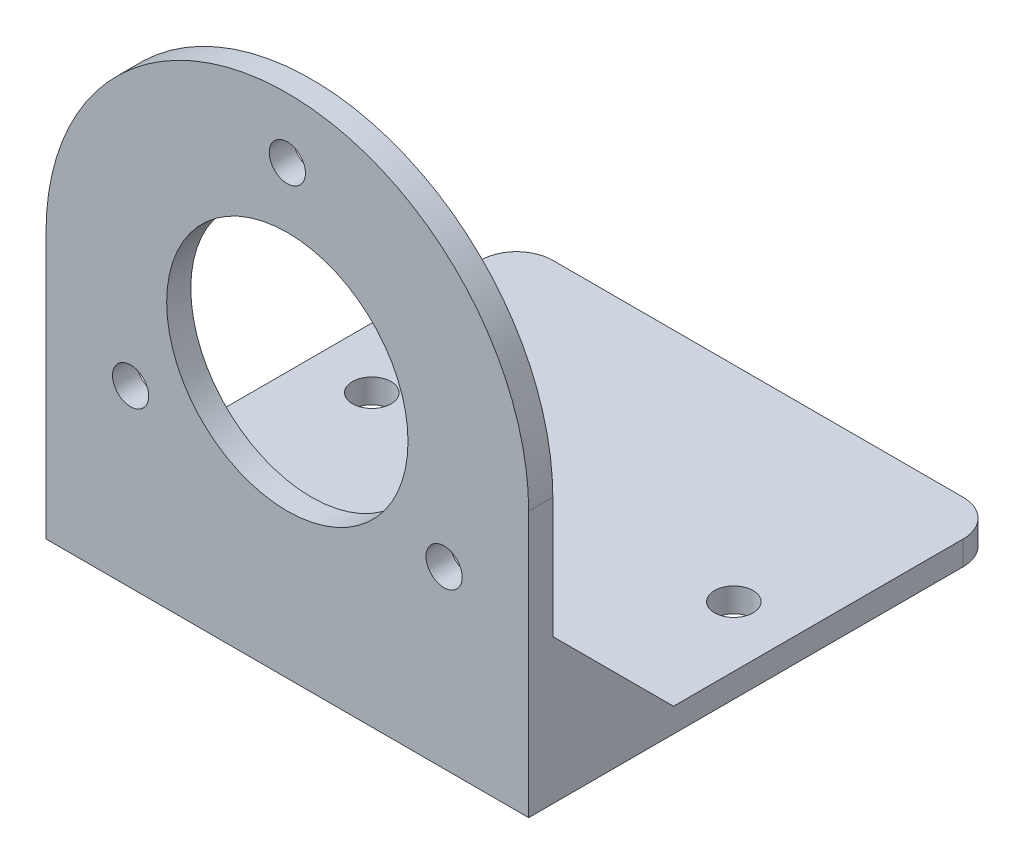
ISO-10303-21;
HEADER;
FILE_DESCRIPTION(('STEP AP214'),'2;1');
FILE_NAME('part.step','',(''),(''),'','','');
FILE_SCHEMA(('AUTOMOTIVE_DESIGN { 1 0 10303 214 1 1 1 1 }'));
ENDSEC;
DATA;
#1=APPLICATION_CONTEXT('core data for automotive mechanical design processes');
#2=APPLICATION_PROTOCOL_DEFINITION('international standard','automotive_design',2000,#1);
#3=PRODUCT_CONTEXT('',#1,'mechanical');
#4=PRODUCT('Part','Part','',(#3));
#5=PRODUCT_RELATED_PRODUCT_CATEGORY('part','',(#4));
#6=PRODUCT_DEFINITION_FORMATION('','',#4);
#7=PRODUCT_DEFINITION_CONTEXT('part definition',#1,'design');
#8=PRODUCT_DEFINITION('design','',#6,#7);
#9=PRODUCT_DEFINITION_SHAPE('','',#8);
#10=(LENGTH_UNIT() NAMED_UNIT(*) SI_UNIT(.MILLI.,.METRE.));
#11=(NAMED_UNIT(*) PLANE_ANGLE_UNIT() SI_UNIT($,.RADIAN.));
#12=(NAMED_UNIT(*) SI_UNIT($,.STERADIAN.) SOLID_ANGLE_UNIT());
#13=UNCERTAINTY_MEASURE_WITH_UNIT(LENGTH_MEASURE(1.E-05),#10,'distance_accuracy_value','');
#14=(GEOMETRIC_REPRESENTATION_CONTEXT(3) GLOBAL_UNCERTAINTY_ASSIGNED_CONTEXT((#13)) GLOBAL_UNIT_ASSIGNED_CONTEXT((#10,
#11,#12)) REPRESENTATION_CONTEXT('',''));
#15=CARTESIAN_POINT('',(0.,0.,0.));
#16=DIRECTION('',(0.,0.,1.));
#17=DIRECTION('',(1.,0.,0.));
#18=AXIS2_PLACEMENT_3D('',#15,#16,#17);
#19=CARTESIAN_POINT('',(0.,0.,0.));
#20=DIRECTION('',(0.,0.,1.));
#21=DIRECTION('',(1.,0.,0.));
#22=AXIS2_PLACEMENT_3D('',#19,#20,#21);
#23=PLANE('',#22);
#24=CARTESIAN_POINT('',(-12.9903810567656,-7.50000000000056,0.));
#25=DIRECTION('',(0.,0.,1.));
#26=DIRECTION('',(1.,0.,0.));
#27=AXIS2_PLACEMENT_3D('',#24,#25,#26);
#28=CIRCLE('',#27,1.50000000000122);
#29=CARTESIAN_POINT('',(-11.4903810567644,-7.50000000000056,0.));
#30=VERTEX_POINT('',#29);
#31=EDGE_CURVE('E196',#30,#30,#28,.T.);
#32=ORIENTED_EDGE('',*,*,#31,.T.);
#33=EDGE_LOOP('',(#32));
#34=FACE_BOUND('',#33,.T.);
#35=CARTESIAN_POINT('',(12.9903810567675,-7.49999999999945,0.));
#36=DIRECTION('',(0.,0.,1.));
#37=DIRECTION('',(1.,0.,0.));
#38=AXIS2_PLACEMENT_3D('',#35,#36,#37);
#39=CIRCLE('',#38,1.50000000000082);
#40=CARTESIAN_POINT('',(14.4903810567684,-7.49999999999945,0.));
#41=VERTEX_POINT('',#40);
#42=EDGE_CURVE('E200',#41,#41,#39,.T.);
#43=ORIENTED_EDGE('',*,*,#42,.T.);
#44=EDGE_LOOP('',(#43));
#45=FACE_BOUND('',#44,.T.);
#46=CARTESIAN_POINT('',(0.,0.,0.));
#47=DIRECTION('',(0.,0.,1.));
#48=DIRECTION('',(1.,0.,0.));
#49=AXIS2_PLACEMENT_3D('',#46,#47,#48);
#50=CIRCLE('',#49,10.);
#51=CARTESIAN_POINT('',(10.,0.,0.));
#52=VERTEX_POINT('',#51);
#53=EDGE_CURVE('E206',#52,#52,#50,.T.);
#54=ORIENTED_EDGE('',*,*,#53,.T.);
#55=EDGE_LOOP('',(#54));
#56=FACE_BOUND('',#55,.T.);
#57=CARTESIAN_POINT('',(0.,15.,0.));
#58=DIRECTION('',(0.,0.,1.));
#59=DIRECTION('',(1.,0.,0.));
#60=AXIS2_PLACEMENT_3D('',#57,#58,#59);
#61=CIRCLE('',#60,1.5);
#62=CARTESIAN_POINT('',(1.5,15.,0.));
#63=VERTEX_POINT('',#62);
#64=EDGE_CURVE('E212',#63,#63,#61,.T.);
#65=ORIENTED_EDGE('',*,*,#64,.T.);
#66=EDGE_LOOP('',(#65));
#67=FACE_BOUND('',#66,.T.);
#68=DIRECTION('',(0.,1.,0.));
#69=VECTOR('',#68,1.);
#70=CARTESIAN_POINT('',(20.,-22.,0.));
#71=LINE('',#70,#69);
#72=CARTESIAN_POINT('',(20.,-10.,0.));
#73=VERTEX_POINT('',#72);
#74=CARTESIAN_POINT('',(20.,0.,0.));
#75=VERTEX_POINT('',#74);
#76=EDGE_CURVE('E225',#73,#75,#71,.T.);
#77=ORIENTED_EDGE('',*,*,#76,.F.);
#78=DIRECTION('',(-1.,0.,0.));
#79=VECTOR('',#78,1.);
#80=CARTESIAN_POINT('',(0.,-10.,0.));
#81=LINE('',#80,#79);
#82=CARTESIAN_POINT('',(18.5,-10.,0.));
#83=VERTEX_POINT('',#82);
#84=EDGE_CURVE('E147',#73,#83,#81,.T.);
#85=ORIENTED_EDGE('',*,*,#84,.T.);
#86=DIRECTION('',(0.,-1.,0.));
#87=VECTOR('',#86,1.);
#88=CARTESIAN_POINT('',(18.5,0.,0.));
#89=LINE('',#88,#87);
#90=CARTESIAN_POINT('',(18.5,-20.,0.));
#91=VERTEX_POINT('',#90);
#92=EDGE_CURVE('E127',#83,#91,#89,.T.);
#93=ORIENTED_EDGE('',*,*,#92,.T.);
#94=DIRECTION('',(1.,0.,0.));
#95=VECTOR('',#94,1.);
#96=CARTESIAN_POINT('',(20.,-20.,0.));
#97=LINE('',#96,#95);
#98=CARTESIAN_POINT('',(-18.5,-20.,0.));
#99=VERTEX_POINT('',#98);
#100=EDGE_CURVE('E142',#99,#91,#97,.T.);
#101=ORIENTED_EDGE('',*,*,#100,.F.);
#102=DIRECTION('',(0.,1.,0.));
#103=VECTOR('',#102,1.);
#104=CARTESIAN_POINT('',(-18.5,0.,0.));
#105=LINE('',#104,#103);
#106=CARTESIAN_POINT('',(-18.5,-10.,0.));
#107=VERTEX_POINT('',#106);
#108=EDGE_CURVE('E50',#99,#107,#105,.T.);
#109=ORIENTED_EDGE('',*,*,#108,.T.);
#110=DIRECTION('',(1.,0.,0.));
#111=VECTOR('',#110,1.);
#112=CARTESIAN_POINT('',(0.,-10.,0.));
#113=LINE('',#112,#111);
#114=CARTESIAN_POINT('',(-20.,-10.,0.));
#115=VERTEX_POINT('',#114);
#116=EDGE_CURVE('E54',#107,#115,#113,.F.);
#117=ORIENTED_EDGE('',*,*,#116,.T.);
#118=DIRECTION('',(0.,-1.,0.));
#119=VECTOR('',#118,1.);
#120=CARTESIAN_POINT('',(-20.,0.,0.));
#121=LINE('',#120,#119);
#122=CARTESIAN_POINT('',(-20.,0.,0.));
#123=VERTEX_POINT('',#122);
#124=EDGE_CURVE('E234',#123,#115,#121,.T.);
#125=ORIENTED_EDGE('',*,*,#124,.F.);
#126=CARTESIAN_POINT('',(0.,0.,0.));
#127=DIRECTION('',(0.,0.,1.));
#128=DIRECTION('',(1.,0.,0.));
#129=AXIS2_PLACEMENT_3D('',#126,#127,#128);
#130=CIRCLE('',#129,20.);
#131=EDGE_CURVE('E218',#75,#123,#130,.T.);
#132=ORIENTED_EDGE('',*,*,#131,.F.);
#133=EDGE_LOOP('',(#77,#85,#93,#101,#109,#117,#125,#132));
#134=FACE_BOUND('',#133,.T.);
#135=ADVANCED_FACE('F35',(#34,#45,#56,#67,#134),#23,.F.);
#136=CARTESIAN_POINT('',(0.,0.,2.));
#137=DIRECTION('',(0.,0.,1.));
#138=DIRECTION('',(1.,0.,0.));
#139=AXIS2_PLACEMENT_3D('',#136,#137,#138);
#140=PLANE('',#139);
#141=DIRECTION('',(0.,1.,0.));
#142=VECTOR('',#141,1.);
#143=CARTESIAN_POINT('',(20.,-22.,2.));
#144=LINE('',#143,#142);
#145=CARTESIAN_POINT('',(20.,-22.,2.));
#146=VERTEX_POINT('',#145);
#147=CARTESIAN_POINT('',(20.,0.,2.));
#148=VERTEX_POINT('',#147);
#149=EDGE_CURVE('E229',#146,#148,#144,.T.);
#150=ORIENTED_EDGE('',*,*,#149,.T.);
#151=CARTESIAN_POINT('',(0.,0.,2.));
#152=DIRECTION('',(0.,0.,1.));
#153=DIRECTION('',(1.,0.,0.));
#154=AXIS2_PLACEMENT_3D('',#151,#152,#153);
#155=CIRCLE('',#154,20.);
#156=CARTESIAN_POINT('',(-20.,0.,2.));
#157=VERTEX_POINT('',#156);
#158=EDGE_CURVE('E221',#148,#157,#155,.T.);
#159=ORIENTED_EDGE('',*,*,#158,.T.);
#160=DIRECTION('',(0.,-1.,0.));
#161=VECTOR('',#160,1.);
#162=CARTESIAN_POINT('',(-20.,0.,2.));
#163=LINE('',#162,#161);
#164=CARTESIAN_POINT('',(-20.,-22.,2.));
#165=VERTEX_POINT('',#164);
#166=EDGE_CURVE('E224',#157,#165,#163,.T.);
#167=ORIENTED_EDGE('',*,*,#166,.T.);
#168=DIRECTION('',(1.,0.,0.));
#169=VECTOR('',#168,1.);
#170=CARTESIAN_POINT('',(-20.,-22.,2.));
#171=LINE('',#170,#169);
#172=EDGE_CURVE('E227',#165,#146,#171,.T.);
#173=ORIENTED_EDGE('',*,*,#172,.T.);
#174=EDGE_LOOP('',(#150,#159,#167,#173));
#175=FACE_BOUND('',#174,.T.);
#176=CARTESIAN_POINT('',(12.9903810567675,-7.49999999999945,2.));
#177=DIRECTION('',(0.,0.,1.));
#178=DIRECTION('',(1.,0.,0.));
#179=AXIS2_PLACEMENT_3D('',#176,#177,#178);
#180=CIRCLE('',#179,1.50000000000082);
#181=CARTESIAN_POINT('',(14.4903810567684,-7.49999999999945,2.));
#182=VERTEX_POINT('',#181);
#183=EDGE_CURVE('E203',#182,#182,#180,.T.);
#184=ORIENTED_EDGE('',*,*,#183,.F.);
#185=EDGE_LOOP('',(#184));
#186=FACE_BOUND('',#185,.T.);
#187=CARTESIAN_POINT('',(0.,15.,2.));
#188=DIRECTION('',(0.,0.,1.));
#189=DIRECTION('',(1.,0.,0.));
#190=AXIS2_PLACEMENT_3D('',#187,#188,#189);
#191=CIRCLE('',#190,1.5);
#192=CARTESIAN_POINT('',(1.5,15.,2.));
#193=VERTEX_POINT('',#192);
#194=EDGE_CURVE('E215',#193,#193,#191,.T.);
#195=ORIENTED_EDGE('',*,*,#194,.F.);
#196=EDGE_LOOP('',(#195));
#197=FACE_BOUND('',#196,.T.);
#198=CARTESIAN_POINT('',(0.,0.,2.));
#199=DIRECTION('',(0.,0.,1.));
#200=DIRECTION('',(1.,0.,0.));
#201=AXIS2_PLACEMENT_3D('',#198,#199,#200);
#202=CIRCLE('',#201,10.);
#203=CARTESIAN_POINT('',(10.,0.,2.));
#204=VERTEX_POINT('',#203);
#205=EDGE_CURVE('E209',#204,#204,#202,.T.);
#206=ORIENTED_EDGE('',*,*,#205,.F.);
#207=EDGE_LOOP('',(#206));
#208=FACE_BOUND('',#207,.T.);
#209=CARTESIAN_POINT('',(-12.9903810567656,-7.50000000000056,2.));
#210=DIRECTION('',(0.,0.,1.));
#211=DIRECTION('',(1.,0.,0.));
#212=AXIS2_PLACEMENT_3D('',#209,#210,#211);
#213=CIRCLE('',#212,1.50000000000122);
#214=CARTESIAN_POINT('',(-11.4903810567644,-7.50000000000056,2.));
#215=VERTEX_POINT('',#214);
#216=EDGE_CURVE('E197',#215,#215,#213,.T.);
#217=ORIENTED_EDGE('',*,*,#216,.F.);
#218=EDGE_LOOP('',(#217));
#219=FACE_BOUND('',#218,.T.);
#220=ADVANCED_FACE('F297',(#175,#186,#197,#208,#219),#140,.T.);
#221=CARTESIAN_POINT('',(0.,0.,2.));
#222=DIRECTION('',(0.,0.,-1.));
#223=DIRECTION('',(-1.,0.,0.));
#224=AXIS2_PLACEMENT_3D('',#221,#222,#223);
#225=CYLINDRICAL_SURFACE('',#224,20.);
#226=ORIENTED_EDGE('',*,*,#131,.T.);
#227=DIRECTION('',(0.,0.,-1.));
#228=VECTOR('',#227,1.);
#229=CARTESIAN_POINT('',(-20.,0.,2.));
#230=LINE('',#229,#228);
#231=EDGE_CURVE('E245',#157,#123,#230,.T.);
#232=ORIENTED_EDGE('',*,*,#231,.F.);
#233=ORIENTED_EDGE('',*,*,#158,.F.);
#234=DIRECTION('',(0.,0.,-1.));
#235=VECTOR('',#234,1.);
#236=CARTESIAN_POINT('',(20.,0.,2.));
#237=LINE('',#236,#235);
#238=EDGE_CURVE('E231',#148,#75,#237,.T.);
#239=ORIENTED_EDGE('',*,*,#238,.T.);
#240=EDGE_LOOP('',(#226,#232,#233,#239));
#241=FACE_BOUND('',#240,.T.);
#242=ADVANCED_FACE('F303',(#241),#225,.T.);
#243=CARTESIAN_POINT('',(-20.,0.,2.));
#244=DIRECTION('',(1.,0.,0.));
#245=DIRECTION('',(0.,1.,0.));
#246=AXIS2_PLACEMENT_3D('',#243,#244,#245);
#247=PLANE('',#246);
#248=DIRECTION('',(0.,0.,-1.));
#249=VECTOR('',#248,1.);
#250=CARTESIAN_POINT('',(-20.,-22.,2.));
#251=LINE('',#250,#249);
#252=CARTESIAN_POINT('',(-20.,-22.,-34.));
#253=VERTEX_POINT('',#252);
#254=EDGE_CURVE('E242',#165,#253,#251,.T.);
#255=ORIENTED_EDGE('',*,*,#254,.F.);
#256=ORIENTED_EDGE('',*,*,#166,.F.);
#257=ORIENTED_EDGE('',*,*,#231,.T.);
#258=ORIENTED_EDGE('',*,*,#124,.T.);
#259=DIRECTION('',(0.,-0.707106781186539,-0.707106781186556));
#260=VECTOR('',#259,1.);
#261=CARTESIAN_POINT('',(-20.,-10.,0.));
#262=LINE('',#261,#260);
#263=CARTESIAN_POINT('',(-20.,-20.,-10.0000000000002));
#264=VERTEX_POINT('',#263);
#265=EDGE_CURVE('E149',#115,#264,#262,.T.);
#266=ORIENTED_EDGE('',*,*,#265,.T.);
#267=DIRECTION('',(0.,0.,1.));
#268=VECTOR('',#267,1.);
#269=CARTESIAN_POINT('',(-20.,-20.,-37.));
#270=LINE('',#269,#268);
#271=CARTESIAN_POINT('',(-20.,-20.,-34.));
#272=VERTEX_POINT('',#271);
#273=EDGE_CURVE('E194',#272,#264,#270,.T.);
#274=ORIENTED_EDGE('',*,*,#273,.F.);
#275=DIRECTION('',(0.,1.,0.));
#276=VECTOR('',#275,1.);
#277=CARTESIAN_POINT('',(-20.,-22.,-34.));
#278=LINE('',#277,#276);
#279=EDGE_CURVE('E258',#272,#253,#278,.F.);
#280=ORIENTED_EDGE('',*,*,#279,.T.);
#281=EDGE_LOOP('',(#255,#256,#257,#258,#266,#274,#280));
#282=FACE_BOUND('',#281,.T.);
#283=ADVANCED_FACE('F277',(#282),#247,.F.);
#284=CARTESIAN_POINT('',(-20.,-22.,2.));
#285=DIRECTION('',(0.,1.,0.));
#286=DIRECTION('',(0.,0.,1.));
#287=AXIS2_PLACEMENT_3D('',#284,#285,#286);
#288=PLANE('',#287);
#289=CARTESIAN_POINT('',(-15.,-22.,-20.));
#290=DIRECTION('',(0.,1.,0.));
#291=DIRECTION('',(1.,0.,0.));
#292=AXIS2_PLACEMENT_3D('',#289,#290,#291);
#293=CIRCLE('',#292,1.6);
#294=CARTESIAN_POINT('',(-13.4,-22.,-20.));
#295=VERTEX_POINT('',#294);
#296=EDGE_CURVE('E175',#295,#295,#293,.T.);
#297=ORIENTED_EDGE('',*,*,#296,.T.);
#298=EDGE_LOOP('',(#297));
#299=FACE_BOUND('',#298,.T.);
#300=CARTESIAN_POINT('',(-15.,-22.,-3.));
#301=DIRECTION('',(0.,1.,0.));
#302=DIRECTION('',(1.,0.,0.));
#303=AXIS2_PLACEMENT_3D('',#300,#301,#302);
#304=CIRCLE('',#303,1.6);
#305=CARTESIAN_POINT('',(-13.4,-22.,-3.));
#306=VERTEX_POINT('',#305);
#307=EDGE_CURVE('E169',#306,#306,#304,.T.);
#308=ORIENTED_EDGE('',*,*,#307,.T.);
#309=EDGE_LOOP('',(#308));
#310=FACE_BOUND('',#309,.T.);
#311=CARTESIAN_POINT('',(15.,-22.,-3.));
#312=DIRECTION('',(0.,1.,0.));
#313=DIRECTION('',(-1.,0.,0.));
#314=AXIS2_PLACEMENT_3D('',#311,#312,#313);
#315=CIRCLE('',#314,1.6);
#316=CARTESIAN_POINT('',(13.4,-22.,-3.));
#317=VERTEX_POINT('',#316);
#318=EDGE_CURVE('E162',#317,#317,#315,.T.);
#319=ORIENTED_EDGE('',*,*,#318,.T.);
#320=EDGE_LOOP('',(#319));
#321=FACE_BOUND('',#320,.T.);
#322=CARTESIAN_POINT('',(15.,-22.,-20.));
#323=DIRECTION('',(0.,1.,0.));
#324=DIRECTION('',(-1.,0.,0.));
#325=AXIS2_PLACEMENT_3D('',#322,#323,#324);
#326=CIRCLE('',#325,1.6);
#327=CARTESIAN_POINT('',(13.4,-22.,-20.));
#328=VERTEX_POINT('',#327);
#329=EDGE_CURVE('E180',#328,#328,#326,.T.);
#330=ORIENTED_EDGE('',*,*,#329,.T.);
#331=EDGE_LOOP('',(#330));
#332=FACE_BOUND('',#331,.T.);
#333=ORIENTED_EDGE('',*,*,#254,.T.);
#334=CARTESIAN_POINT('',(-17.,-22.,-34.));
#335=DIRECTION('',(0.,1.,0.));
#336=DIRECTION('',(0.,0.,1.));
#337=AXIS2_PLACEMENT_3D('',#334,#335,#336);
#338=CIRCLE('',#337,3.);
#339=CARTESIAN_POINT('',(-17.,-22.,-37.));
#340=VERTEX_POINT('',#339);
#341=EDGE_CURVE('E43',#253,#340,#338,.F.);
#342=ORIENTED_EDGE('',*,*,#341,.T.);
#343=DIRECTION('',(-1.,0.,0.));
#344=VECTOR('',#343,1.);
#345=CARTESIAN_POINT('',(20.,-22.,-37.));
#346=LINE('',#345,#344);
#347=CARTESIAN_POINT('',(17.,-22.,-37.));
#348=VERTEX_POINT('',#347);
#349=EDGE_CURVE('E188',#348,#340,#346,.T.);
#350=ORIENTED_EDGE('',*,*,#349,.F.);
#351=CARTESIAN_POINT('',(17.,-22.,-34.));
#352=DIRECTION('',(0.,1.,0.));
#353=DIRECTION('',(0.,0.,1.));
#354=AXIS2_PLACEMENT_3D('',#351,#352,#353);
#355=CIRCLE('',#354,3.);
#356=CARTESIAN_POINT('',(20.,-22.,-34.));
#357=VERTEX_POINT('',#356);
#358=EDGE_CURVE('E260',#348,#357,#355,.F.);
#359=ORIENTED_EDGE('',*,*,#358,.T.);
#360=DIRECTION('',(0.,0.,-1.));
#361=VECTOR('',#360,1.);
#362=CARTESIAN_POINT('',(20.,-22.,2.));
#363=LINE('',#362,#361);
#364=EDGE_CURVE('E239',#146,#357,#363,.T.);
#365=ORIENTED_EDGE('',*,*,#364,.F.);
#366=ORIENTED_EDGE('',*,*,#172,.F.);
#367=EDGE_LOOP('',(#333,#342,#350,#359,#365,#366));
#368=FACE_BOUND('',#367,.T.);
#369=ADVANCED_FACE('F264',(#299,#310,#321,#332,#368),#288,.F.);
#370=CARTESIAN_POINT('',(20.,-22.,2.));
#371=DIRECTION('',(-1.,0.,0.));
#372=DIRECTION('',(0.,-1.,0.));
#373=AXIS2_PLACEMENT_3D('',#370,#371,#372);
#374=PLANE('',#373);
#375=DIRECTION('',(0.,-0.707106781186539,-0.707106781186556));
#376=VECTOR('',#375,1.);
#377=CARTESIAN_POINT('',(20.,-10.,0.));
#378=LINE('',#377,#376);
#379=CARTESIAN_POINT('',(20.,-20.,-10.0000000000002));
#380=VERTEX_POINT('',#379);
#381=EDGE_CURVE('E135',#73,#380,#378,.T.);
#382=ORIENTED_EDGE('',*,*,#381,.F.);
#383=ORIENTED_EDGE('',*,*,#76,.T.);
#384=ORIENTED_EDGE('',*,*,#238,.F.);
#385=ORIENTED_EDGE('',*,*,#149,.F.);
#386=ORIENTED_EDGE('',*,*,#364,.T.);
#387=DIRECTION('',(0.,-1.,0.));
#388=VECTOR('',#387,1.);
#389=CARTESIAN_POINT('',(20.,-20.,-34.));
#390=LINE('',#389,#388);
#391=CARTESIAN_POINT('',(20.,-20.,-34.));
#392=VERTEX_POINT('',#391);
#393=EDGE_CURVE('E11',#357,#392,#390,.F.);
#394=ORIENTED_EDGE('',*,*,#393,.T.);
#395=DIRECTION('',(0.,0.,1.));
#396=VECTOR('',#395,1.);
#397=CARTESIAN_POINT('',(20.,-20.,-37.));
#398=LINE('',#397,#396);
#399=EDGE_CURVE('E191',#392,#380,#398,.T.);
#400=ORIENTED_EDGE('',*,*,#399,.T.);
#401=EDGE_LOOP('',(#382,#383,#384,#385,#386,#394,#400));
#402=FACE_BOUND('',#401,.T.);
#403=ADVANCED_FACE('F309',(#402),#374,.F.);
#404=CARTESIAN_POINT('',(0.,15.,2.));
#405=DIRECTION('',(0.,0.,-1.));
#406=DIRECTION('',(-1.,0.,0.));
#407=AXIS2_PLACEMENT_3D('',#404,#405,#406);
#408=CYLINDRICAL_SURFACE('',#407,1.5);
#409=ORIENTED_EDGE('',*,*,#194,.T.);
#410=EDGE_LOOP('',(#409));
#411=FACE_BOUND('',#410,.T.);
#412=ORIENTED_EDGE('',*,*,#64,.F.);
#413=EDGE_LOOP('',(#412));
#414=FACE_BOUND('',#413,.T.);
#415=ADVANCED_FACE('F312',(#411,#414),#408,.F.);
#416=CARTESIAN_POINT('',(0.,0.,2.));
#417=DIRECTION('',(0.,0.,-1.));
#418=DIRECTION('',(-1.,0.,0.));
#419=AXIS2_PLACEMENT_3D('',#416,#417,#418);
#420=CYLINDRICAL_SURFACE('',#419,10.);
#421=ORIENTED_EDGE('',*,*,#205,.T.);
#422=EDGE_LOOP('',(#421));
#423=FACE_BOUND('',#422,.T.);
#424=ORIENTED_EDGE('',*,*,#53,.F.);
#425=EDGE_LOOP('',(#424));
#426=FACE_BOUND('',#425,.T.);
#427=ADVANCED_FACE('F345',(#423,#426),#420,.F.);
#428=CARTESIAN_POINT('',(12.9903810567675,-7.49999999999945,2.));
#429=DIRECTION('',(0.,0.,-1.));
#430=DIRECTION('',(-1.,0.,0.));
#431=AXIS2_PLACEMENT_3D('',#428,#429,#430);
#432=CYLINDRICAL_SURFACE('',#431,1.50000000000082);
#433=ORIENTED_EDGE('',*,*,#183,.T.);
#434=EDGE_LOOP('',(#433));
#435=FACE_BOUND('',#434,.T.);
#436=ORIENTED_EDGE('',*,*,#42,.F.);
#437=EDGE_LOOP('',(#436));
#438=FACE_BOUND('',#437,.T.);
#439=ADVANCED_FACE('F341',(#435,#438),#432,.F.);
#440=CARTESIAN_POINT('',(-12.9903810567656,-7.50000000000056,2.));
#441=DIRECTION('',(0.,0.,-1.));
#442=DIRECTION('',(-1.,0.,0.));
#443=AXIS2_PLACEMENT_3D('',#440,#441,#442);
#444=CYLINDRICAL_SURFACE('',#443,1.50000000000122);
#445=ORIENTED_EDGE('',*,*,#216,.T.);
#446=EDGE_LOOP('',(#445));
#447=FACE_BOUND('',#446,.T.);
#448=ORIENTED_EDGE('',*,*,#31,.F.);
#449=EDGE_LOOP('',(#448));
#450=FACE_BOUND('',#449,.T.);
#451=ADVANCED_FACE('F333',(#447,#450),#444,.F.);
#452=CARTESIAN_POINT('',(20.,-20.,-37.));
#453=DIRECTION('',(0.,-1.,0.));
#454=DIRECTION('',(1.,0.,0.));
#455=AXIS2_PLACEMENT_3D('',#452,#453,#454);
#456=PLANE('',#455);
#457=CARTESIAN_POINT('',(-15.,-20.,-20.));
#458=DIRECTION('',(0.,1.,0.));
#459=DIRECTION('',(1.,0.,0.));
#460=AXIS2_PLACEMENT_3D('',#457,#458,#459);
#461=CIRCLE('',#460,1.6);
#462=CARTESIAN_POINT('',(-13.4,-20.,-20.));
#463=VERTEX_POINT('',#462);
#464=EDGE_CURVE('E161',#463,#463,#461,.T.);
#465=ORIENTED_EDGE('',*,*,#464,.F.);
#466=EDGE_LOOP('',(#465));
#467=FACE_BOUND('',#466,.T.);
#468=CARTESIAN_POINT('',(-15.,-20.,-3.));
#469=DIRECTION('',(0.,1.,0.));
#470=DIRECTION('',(1.,0.,0.));
#471=AXIS2_PLACEMENT_3D('',#468,#469,#470);
#472=CIRCLE('',#471,1.6);
#473=CARTESIAN_POINT('',(-13.4,-20.,-3.));
#474=VERTEX_POINT('',#473);
#475=EDGE_CURVE('E172',#474,#474,#472,.T.);
#476=ORIENTED_EDGE('',*,*,#475,.F.);
#477=EDGE_LOOP('',(#476));
#478=FACE_BOUND('',#477,.T.);
#479=CARTESIAN_POINT('',(15.,-20.,-3.));
#480=DIRECTION('',(0.,1.,0.));
#481=DIRECTION('',(-1.,0.,0.));
#482=AXIS2_PLACEMENT_3D('',#479,#480,#481);
#483=CIRCLE('',#482,1.6);
#484=CARTESIAN_POINT('',(13.4,-20.,-3.));
#485=VERTEX_POINT('',#484);
#486=EDGE_CURVE('E166',#485,#485,#483,.T.);
#487=ORIENTED_EDGE('',*,*,#486,.F.);
#488=EDGE_LOOP('',(#487));
#489=FACE_BOUND('',#488,.T.);
#490=CARTESIAN_POINT('',(15.,-20.,-20.));
#491=DIRECTION('',(0.,1.,0.));
#492=DIRECTION('',(-1.,0.,0.));
#493=AXIS2_PLACEMENT_3D('',#490,#491,#492);
#494=CIRCLE('',#493,1.6);
#495=CARTESIAN_POINT('',(13.4,-20.,-20.));
#496=VERTEX_POINT('',#495);
#497=EDGE_CURVE('E165',#496,#496,#494,.T.);
#498=ORIENTED_EDGE('',*,*,#497,.F.);
#499=EDGE_LOOP('',(#498));
#500=FACE_BOUND('',#499,.T.);
#501=DIRECTION('',(0.,0.,1.));
#502=VECTOR('',#501,1.);
#503=CARTESIAN_POINT('',(18.5,-20.,-17.5));
#504=LINE('',#503,#502);
#505=CARTESIAN_POINT('',(18.5,-20.,-10.0000000000002));
#506=VERTEX_POINT('',#505);
#507=EDGE_CURVE('E125',#506,#91,#504,.T.);
#508=ORIENTED_EDGE('',*,*,#507,.F.);
#509=DIRECTION('',(-1.,0.,0.));
#510=VECTOR('',#509,1.);
#511=CARTESIAN_POINT('',(20.,-20.,-10.0000000000002));
#512=LINE('',#511,#510);
#513=EDGE_CURVE('E130',#380,#506,#512,.T.);
#514=ORIENTED_EDGE('',*,*,#513,.F.);
#515=ORIENTED_EDGE('',*,*,#399,.F.);
#516=CARTESIAN_POINT('',(17.,-20.,-34.));
#517=DIRECTION('',(0.,-1.,0.));
#518=DIRECTION('',(1.,0.,0.));
#519=AXIS2_PLACEMENT_3D('',#516,#517,#518);
#520=CIRCLE('',#519,3.);
#521=CARTESIAN_POINT('',(17.,-20.,-37.));
#522=VERTEX_POINT('',#521);
#523=EDGE_CURVE('E254',#392,#522,#520,.F.);
#524=ORIENTED_EDGE('',*,*,#523,.T.);
#525=DIRECTION('',(1.,0.,0.));
#526=VECTOR('',#525,1.);
#527=CARTESIAN_POINT('',(20.,-20.,-37.));
#528=LINE('',#527,#526);
#529=CARTESIAN_POINT('',(-17.,-20.,-37.));
#530=VERTEX_POINT('',#529);
#531=EDGE_CURVE('E185',#530,#522,#528,.T.);
#532=ORIENTED_EDGE('',*,*,#531,.F.);
#533=CARTESIAN_POINT('',(-17.,-20.,-34.));
#534=DIRECTION('',(0.,-1.,0.));
#535=DIRECTION('',(1.,0.,0.));
#536=AXIS2_PLACEMENT_3D('',#533,#534,#535);
#537=CIRCLE('',#536,3.);
#538=EDGE_CURVE('E256',#530,#272,#537,.F.);
#539=ORIENTED_EDGE('',*,*,#538,.T.);
#540=ORIENTED_EDGE('',*,*,#273,.T.);
#541=DIRECTION('',(1.,0.,0.));
#542=VECTOR('',#541,1.);
#543=CARTESIAN_POINT('',(-20.,-20.,-10.0000000000002));
#544=LINE('',#543,#542);
#545=CARTESIAN_POINT('',(-18.5,-20.,-10.0000000000002));
#546=VERTEX_POINT('',#545);
#547=EDGE_CURVE('E153',#264,#546,#544,.T.);
#548=ORIENTED_EDGE('',*,*,#547,.T.);
#549=DIRECTION('',(0.,0.,1.));
#550=VECTOR('',#549,1.);
#551=CARTESIAN_POINT('',(-18.5,-20.,-17.5));
#552=LINE('',#551,#550);
#553=EDGE_CURVE('E154',#546,#99,#552,.T.);
#554=ORIENTED_EDGE('',*,*,#553,.T.);
#555=ORIENTED_EDGE('',*,*,#100,.T.);
#556=EDGE_LOOP('',(#508,#514,#515,#524,#532,#539,#540,#548,#554,#555));
#557=FACE_BOUND('',#556,.T.);
#558=ADVANCED_FACE('F141',(#467,#478,#489,#500,#557),#456,.F.);
#559=CARTESIAN_POINT('',(0.,0.,-37.));
#560=DIRECTION('',(0.,0.,-1.));
#561=DIRECTION('',(-1.,0.,0.));
#562=AXIS2_PLACEMENT_3D('',#559,#560,#561);
#563=PLANE('',#562);
#564=ORIENTED_EDGE('',*,*,#349,.T.);
#565=DIRECTION('',(0.,1.,0.));
#566=VECTOR('',#565,1.);
#567=CARTESIAN_POINT('',(-17.,-20.,-37.));
#568=LINE('',#567,#566);
#569=EDGE_CURVE('E251',#340,#530,#568,.T.);
#570=ORIENTED_EDGE('',*,*,#569,.T.);
#571=ORIENTED_EDGE('',*,*,#531,.T.);
#572=DIRECTION('',(0.,-1.,0.));
#573=VECTOR('',#572,1.);
#574=CARTESIAN_POINT('',(17.,-22.,-37.));
#575=LINE('',#574,#573);
#576=EDGE_CURVE('E248',#522,#348,#575,.T.);
#577=ORIENTED_EDGE('',*,*,#576,.T.);
#578=EDGE_LOOP('',(#564,#570,#571,#577));
#579=FACE_BOUND('',#578,.T.);
#580=ADVANCED_FACE('F271',(#579),#563,.T.);
#581=CARTESIAN_POINT('',(-17.,0.,-34.));
#582=DIRECTION('',(0.,-1.,0.));
#583=DIRECTION('',(1.,0.,0.));
#584=AXIS2_PLACEMENT_3D('',#581,#582,#583);
#585=CYLINDRICAL_SURFACE('',#584,3.);
#586=ORIENTED_EDGE('',*,*,#341,.F.);
#587=ORIENTED_EDGE('',*,*,#279,.F.);
#588=ORIENTED_EDGE('',*,*,#538,.F.);
#589=ORIENTED_EDGE('',*,*,#569,.F.);
#590=EDGE_LOOP('',(#586,#587,#588,#589));
#591=FACE_BOUND('',#590,.T.);
#592=ADVANCED_FACE('F274',(#591),#585,.T.);
#593=CARTESIAN_POINT('',(17.,0.,-34.));
#594=DIRECTION('',(0.,1.,0.));
#595=DIRECTION('',(-1.,0.,0.));
#596=AXIS2_PLACEMENT_3D('',#593,#594,#595);
#597=CYLINDRICAL_SURFACE('',#596,3.);
#598=ORIENTED_EDGE('',*,*,#523,.F.);
#599=ORIENTED_EDGE('',*,*,#393,.F.);
#600=ORIENTED_EDGE('',*,*,#358,.F.);
#601=ORIENTED_EDGE('',*,*,#576,.F.);
#602=EDGE_LOOP('',(#598,#599,#600,#601));
#603=FACE_BOUND('',#602,.T.);
#604=ADVANCED_FACE('F37',(#603),#597,.T.);
#605=CARTESIAN_POINT('',(15.,-22.,-20.));
#606=DIRECTION('',(0.,1.,0.));
#607=DIRECTION('',(-1.,0.,0.));
#608=AXIS2_PLACEMENT_3D('',#605,#606,#607);
#609=CYLINDRICAL_SURFACE('',#608,1.6);
#610=ORIENTED_EDGE('',*,*,#329,.F.);
#611=EDGE_LOOP('',(#610));
#612=FACE_BOUND('',#611,.T.);
#613=ORIENTED_EDGE('',*,*,#497,.T.);
#614=EDGE_LOOP('',(#613));
#615=FACE_BOUND('',#614,.T.);
#616=ADVANCED_FACE('F326',(#612,#615),#609,.F.);
#617=CARTESIAN_POINT('',(15.,-22.,-3.));
#618=DIRECTION('',(0.,1.,0.));
#619=DIRECTION('',(-1.,0.,0.));
#620=AXIS2_PLACEMENT_3D('',#617,#618,#619);
#621=CYLINDRICAL_SURFACE('',#620,1.6);
#622=ORIENTED_EDGE('',*,*,#318,.F.);
#623=EDGE_LOOP('',(#622));
#624=FACE_BOUND('',#623,.T.);
#625=ORIENTED_EDGE('',*,*,#486,.T.);
#626=EDGE_LOOP('',(#625));
#627=FACE_BOUND('',#626,.T.);
#628=ADVANCED_FACE('F412',(#624,#627),#621,.F.);
#629=CARTESIAN_POINT('',(-15.,-22.,-3.));
#630=DIRECTION('',(0.,1.,0.));
#631=DIRECTION('',(-1.,0.,0.));
#632=AXIS2_PLACEMENT_3D('',#629,#630,#631);
#633=CYLINDRICAL_SURFACE('',#632,1.6);
#634=ORIENTED_EDGE('',*,*,#307,.F.);
#635=EDGE_LOOP('',(#634));
#636=FACE_BOUND('',#635,.T.);
#637=ORIENTED_EDGE('',*,*,#475,.T.);
#638=EDGE_LOOP('',(#637));
#639=FACE_BOUND('',#638,.T.);
#640=ADVANCED_FACE('F420',(#636,#639),#633,.F.);
#641=CARTESIAN_POINT('',(-15.,-22.,-20.));
#642=DIRECTION('',(0.,1.,0.));
#643=DIRECTION('',(-1.,0.,0.));
#644=AXIS2_PLACEMENT_3D('',#641,#642,#643);
#645=CYLINDRICAL_SURFACE('',#644,1.6);
#646=ORIENTED_EDGE('',*,*,#296,.F.);
#647=EDGE_LOOP('',(#646));
#648=FACE_BOUND('',#647,.T.);
#649=ORIENTED_EDGE('',*,*,#464,.T.);
#650=EDGE_LOOP('',(#649));
#651=FACE_BOUND('',#650,.T.);
#652=ADVANCED_FACE('F294',(#648,#651),#645,.F.);
#653=CARTESIAN_POINT('',(-20.,-10.,0.));
#654=DIRECTION('',(0.,-0.707106781186556,0.707106781186539));
#655=DIRECTION('',(0.,-0.707106781186539,-0.707106781186556));
#656=AXIS2_PLACEMENT_3D('',#653,#654,#655);
#657=PLANE('',#656);
#658=ORIENTED_EDGE('',*,*,#116,.F.);
#659=DIRECTION('',(0.,-0.707106781186539,-0.707106781186556));
#660=VECTOR('',#659,1.);
#661=CARTESIAN_POINT('',(-18.5,-10.,0.));
#662=LINE('',#661,#660);
#663=EDGE_CURVE('E150',#107,#546,#662,.T.);
#664=ORIENTED_EDGE('',*,*,#663,.T.);
#665=ORIENTED_EDGE('',*,*,#547,.F.);
#666=ORIENTED_EDGE('',*,*,#265,.F.);
#667=EDGE_LOOP('',(#658,#664,#665,#666));
#668=FACE_BOUND('',#667,.T.);
#669=ADVANCED_FACE('F281',(#668),#657,.F.);
#670=CARTESIAN_POINT('',(-18.5,-1.,-17.5));
#671=DIRECTION('',(1.,0.,0.));
#672=DIRECTION('',(0.,1.,0.));
#673=AXIS2_PLACEMENT_3D('',#670,#671,#672);
#674=PLANE('',#673);
#675=ORIENTED_EDGE('',*,*,#108,.F.);
#676=ORIENTED_EDGE('',*,*,#553,.F.);
#677=ORIENTED_EDGE('',*,*,#663,.F.);
#678=EDGE_LOOP('',(#675,#676,#677));
#679=FACE_BOUND('',#678,.T.);
#680=ADVANCED_FACE('F286',(#679),#674,.T.);
#681=CARTESIAN_POINT('',(20.,-10.,0.));
#682=DIRECTION('',(0.,0.707106781186556,-0.707106781186539));
#683=DIRECTION('',(0.,-0.707106781186539,-0.707106781186556));
#684=AXIS2_PLACEMENT_3D('',#681,#682,#683);
#685=PLANE('',#684);
#686=ORIENTED_EDGE('',*,*,#84,.F.);
#687=ORIENTED_EDGE('',*,*,#381,.T.);
#688=ORIENTED_EDGE('',*,*,#513,.T.);
#689=DIRECTION('',(0.,-0.707106781186539,-0.707106781186556));
#690=VECTOR('',#689,1.);
#691=CARTESIAN_POINT('',(18.5,-10.,0.));
#692=LINE('',#691,#690);
#693=EDGE_CURVE('E121',#83,#506,#692,.T.);
#694=ORIENTED_EDGE('',*,*,#693,.F.);
#695=EDGE_LOOP('',(#686,#687,#688,#694));
#696=FACE_BOUND('',#695,.T.);
#697=ADVANCED_FACE('F133',(#696),#685,.T.);
#698=CARTESIAN_POINT('',(18.5,-1.,-17.5));
#699=DIRECTION('',(-1.,0.,0.));
#700=DIRECTION('',(0.,-1.,0.));
#701=AXIS2_PLACEMENT_3D('',#698,#699,#700);
#702=PLANE('',#701);
#703=ORIENTED_EDGE('',*,*,#92,.F.);
#704=ORIENTED_EDGE('',*,*,#693,.T.);
#705=ORIENTED_EDGE('',*,*,#507,.T.);
#706=EDGE_LOOP('',(#703,#704,#705));
#707=FACE_BOUND('',#706,.T.);
#708=ADVANCED_FACE('F123',(#707),#702,.T.);
#709=CLOSED_SHELL('',(#135,#220,#242,#283,#369,#403,#415,#427,#439,#451,#558,#580,#592,#604,
#616,#628,#640,#652,#669,#680,#697,#708));
#710=MANIFOLD_SOLID_BREP('B2',#709);
#711=ADVANCED_BREP_SHAPE_REPRESENTATION('',(#18,#710),#14);
#712=SHAPE_DEFINITION_REPRESENTATION(#9,#711);
ENDSEC;
END-ISO-10303-21;
